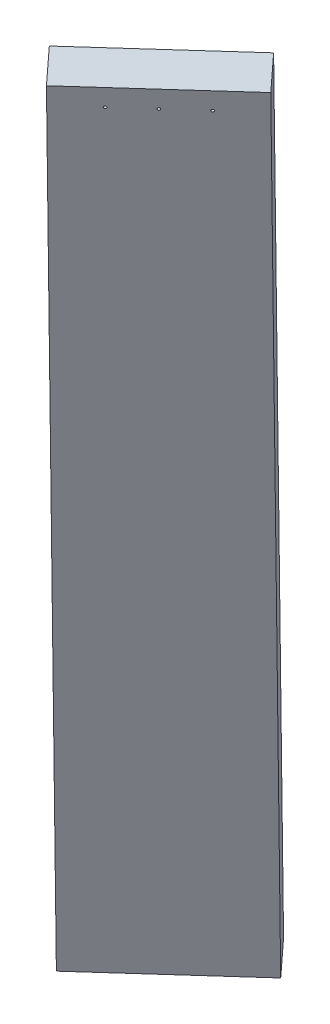
ISO-10303-21;
HEADER;
FILE_DESCRIPTION(('STEP AP214'),'2;1');
FILE_NAME('part.step','',(''),(''),'','','');
FILE_SCHEMA(('AUTOMOTIVE_DESIGN { 1 0 10303 214 1 1 1 1 }'));
ENDSEC;
DATA;
#1=APPLICATION_CONTEXT('core data for automotive mechanical design processes');
#2=APPLICATION_PROTOCOL_DEFINITION('international standard','automotive_design',2000,#1);
#3=PRODUCT_CONTEXT('',#1,'mechanical');
#4=PRODUCT('Part','Part','',(#3));
#5=PRODUCT_RELATED_PRODUCT_CATEGORY('part','',(#4));
#6=PRODUCT_DEFINITION_FORMATION('','',#4);
#7=PRODUCT_DEFINITION_CONTEXT('part definition',#1,'design');
#8=PRODUCT_DEFINITION('design','',#6,#7);
#9=PRODUCT_DEFINITION_SHAPE('','',#8);
#10=(LENGTH_UNIT() NAMED_UNIT(*) SI_UNIT(.MILLI.,.METRE.));
#11=(NAMED_UNIT(*) PLANE_ANGLE_UNIT() SI_UNIT($,.RADIAN.));
#12=(NAMED_UNIT(*) SI_UNIT($,.STERADIAN.) SOLID_ANGLE_UNIT());
#13=UNCERTAINTY_MEASURE_WITH_UNIT(LENGTH_MEASURE(1.E-05),#10,'distance_accuracy_value','');
#14=(GEOMETRIC_REPRESENTATION_CONTEXT(3) GLOBAL_UNCERTAINTY_ASSIGNED_CONTEXT((#13)) GLOBAL_UNIT_ASSIGNED_CONTEXT((#10,
#11,#12)) REPRESENTATION_CONTEXT('',''));
#15=CARTESIAN_POINT('',(0.,0.,0.));
#16=DIRECTION('',(0.,0.,1.));
#17=DIRECTION('',(1.,0.,0.));
#18=AXIS2_PLACEMENT_3D('',#15,#16,#17);
#19=CARTESIAN_POINT('',(-34.122427395229,436.359414766434,-238.340547783575));
#20=DIRECTION('',(0.659822359652896,-0.170734934507998,0.731767747198955));
#21=DIRECTION('',(0.742672409332212,0.,-0.669654905467501));
#22=AXIS2_PLACEMENT_3D('',#19,#20,#21);
#23=PLANE('',#22);
#24=CARTESIAN_POINT('',(-77.0709391759029,427.024147290678,-201.792705646519));
#25=DIRECTION('',(0.659822359652896,-0.170734934507998,0.731767747198955));
#26=DIRECTION('',(0.742672409332212,0.,-0.669654905467501));
#27=AXIS2_PLACEMENT_3D('',#24,#25,#26);
#28=CIRCLE('',#27,0.634999999999944);
#29=CARTESIAN_POINT('',(-76.599342195977,427.024147290678,-202.217936511491));
#30=VERTEX_POINT('',#29);
#31=EDGE_CURVE('E129',#30,#30,#28,.T.);
#32=ORIENTED_EDGE('',*,*,#31,.T.);
#33=EDGE_LOOP('',(#32));
#34=FACE_BOUND('',#33,.T.);
#35=CARTESIAN_POINT('',(-63.5096908061252,427.007987405434,-214.024419862397));
#36=DIRECTION('',(0.659822359652896,-0.170734934507998,0.731767747198955));
#37=DIRECTION('',(0.742672409332212,0.,-0.669654905467501));
#38=AXIS2_PLACEMENT_3D('',#35,#36,#37);
#39=CIRCLE('',#38,0.635000000000017);
#40=CARTESIAN_POINT('',(-63.0380938261993,427.007987405434,-214.449650727369));
#41=VERTEX_POINT('',#40);
#42=EDGE_CURVE('E119',#41,#41,#39,.T.);
#43=ORIENTED_EDGE('',*,*,#42,.T.);
#44=EDGE_LOOP('',(#43));
#45=FACE_BOUND('',#44,.T.);
#46=CARTESIAN_POINT('',(-49.9484424363475,426.991827520191,-226.256134078275));
#47=DIRECTION('',(0.659822359652896,-0.170734934507998,0.731767747198955));
#48=DIRECTION('',(0.742672409332212,0.,-0.669654905467501));
#49=AXIS2_PLACEMENT_3D('',#46,#47,#48);
#50=CIRCLE('',#49,0.634999999999992);
#51=CARTESIAN_POINT('',(-49.4768454564216,426.991827520191,-226.681364943247));
#52=VERTEX_POINT('',#51);
#53=EDGE_CURVE('E116',#52,#52,#50,.T.);
#54=ORIENTED_EDGE('',*,*,#53,.T.);
#55=EDGE_LOOP('',(#54));
#56=FACE_BOUND('',#55,.T.);
#57=DIRECTION('',(-0.742569432859524,0.000884862255525242,0.669768508069373));
#58=VECTOR('',#57,1.);
#59=CARTESIAN_POINT('',(-83.0493458819597,17.1564679610068,-292.031781118628));
#60=LINE('',#59,#58);
#61=CARTESIAN_POINT('',(-83.0493458819597,17.1564679610068,-292.031781118628));
#62=VERTEX_POINT('',#61);
#63=CARTESIAN_POINT('',(-139.63311515957,17.2238944392505,-240.995440201568));
#64=VERTEX_POINT('',#63);
#65=EDGE_CURVE('E105',#62,#64,#60,.T.);
#66=ORIENTED_EDGE('',*,*,#65,.T.);
#67=DIRECTION('',(-0.115000396020051,-0.985316598437953,-0.126198691585504));
#68=VECTOR('',#67,1.);
#69=CARTESIAN_POINT('',(-90.7061966728394,436.426841244678,-187.304206866515));
#70=LINE('',#69,#68);
#71=CARTESIAN_POINT('',(-90.7061966728394,436.426841244678,-187.304206866515));
#72=VERTEX_POINT('',#71);
#73=EDGE_CURVE('E11',#72,#64,#70,.T.);
#74=ORIENTED_EDGE('',*,*,#73,.F.);
#75=DIRECTION('',(-0.742569432859524,0.000884862255525242,0.669768508069373));
#76=VECTOR('',#75,1.);
#77=CARTESIAN_POINT('',(-34.122427395229,436.359414766434,-238.340547783575));
#78=LINE('',#77,#76);
#79=CARTESIAN_POINT('',(-34.122427395229,436.359414766434,-238.340547783575));
#80=VERTEX_POINT('',#79);
#81=EDGE_CURVE('E92',#80,#72,#78,.T.);
#82=ORIENTED_EDGE('',*,*,#81,.F.);
#83=DIRECTION('',(-0.115000396020051,-0.985316598437953,-0.126198691585504));
#84=VECTOR('',#83,1.);
#85=CARTESIAN_POINT('',(-34.122427395229,436.359414766434,-238.340547783575));
#86=LINE('',#85,#84);
#87=EDGE_CURVE('E101',#80,#62,#86,.T.);
#88=ORIENTED_EDGE('',*,*,#87,.T.);
#89=EDGE_LOOP('',(#66,#74,#82,#88));
#90=FACE_BOUND('',#89,.T.);
#91=ADVANCED_FACE('F39',(#34,#45,#56,#90),#23,.F.);
#92=CARTESIAN_POINT('',(-90.7061966728394,436.426841244678,-187.304206866515));
#93=DIRECTION('',(0.742569432859525,-0.000884862255525373,-0.669768508069372));
#94=DIRECTION('',(-0.669768770277605,0.,-0.742569723568653));
#95=AXIS2_PLACEMENT_3D('',#92,#93,#94);
#96=PLANE('',#95);
#97=DIRECTION('',(0.659822359652895,-0.170734934507998,0.731767747198956));
#98=VECTOR('',#97,1.);
#99=CARTESIAN_POINT('',(-139.63311515957,17.2238944392505,-240.995440201568));
#100=LINE('',#99,#98);
#101=CARTESIAN_POINT('',(-127.063499208182,13.9713939368731,-227.055264617428));
#102=VERTEX_POINT('',#101);
#103=EDGE_CURVE('E96',#64,#102,#100,.T.);
#104=ORIENTED_EDGE('',*,*,#103,.T.);
#105=DIRECTION('',(-0.115000396020051,-0.985316598437953,-0.126198691585504));
#106=VECTOR('',#105,1.);
#107=CARTESIAN_POINT('',(-78.1365807214517,433.1743407423,-173.364031282375));
#108=LINE('',#107,#106);
#109=CARTESIAN_POINT('',(-78.1365807214517,433.1743407423,-173.364031282375));
#110=VERTEX_POINT('',#109);
#111=EDGE_CURVE('E48',#110,#102,#108,.T.);
#112=ORIENTED_EDGE('',*,*,#111,.F.);
#113=DIRECTION('',(0.659822359652895,-0.170734934507998,0.731767747198956));
#114=VECTOR('',#113,1.);
#115=CARTESIAN_POINT('',(-90.7061966728394,436.426841244678,-187.304206866515));
#116=LINE('',#115,#114);
#117=EDGE_CURVE('E87',#72,#110,#116,.T.);
#118=ORIENTED_EDGE('',*,*,#117,.F.);
#119=ORIENTED_EDGE('',*,*,#73,.T.);
#120=EDGE_LOOP('',(#104,#112,#118,#119));
#121=FACE_BOUND('',#120,.T.);
#122=ADVANCED_FACE('F95',(#121),#96,.F.);
#123=CARTESIAN_POINT('',(-78.1365807214517,433.1743407423,-173.364031282375));
#124=DIRECTION('',(-0.659822359652896,0.170734934507998,-0.731767747198955));
#125=DIRECTION('',(-0.742672409332212,0.,0.669654905467501));
#126=AXIS2_PLACEMENT_3D('',#123,#124,#125);
#127=PLANE('',#126);
#128=CARTESIAN_POINT('',(-64.5013232245152,423.7716467883,-187.852530062379));
#129=DIRECTION('',(-0.659822359652896,0.170734934507998,-0.731767747198955));
#130=DIRECTION('',(-0.742672409332212,0.,0.669654905467501));
#131=AXIS2_PLACEMENT_3D('',#128,#129,#130);
#132=CIRCLE('',#131,0.634999999999944);
#133=CARTESIAN_POINT('',(-64.9729202044411,423.7716467883,-187.427299197407));
#134=VERTEX_POINT('',#133);
#135=EDGE_CURVE('E42',#134,#134,#132,.T.);
#136=ORIENTED_EDGE('',*,*,#135,.T.);
#137=EDGE_LOOP('',(#136));
#138=FACE_BOUND('',#137,.T.);
#139=CARTESIAN_POINT('',(-50.9400748547375,423.755486903057,-200.084244278257));
#140=DIRECTION('',(-0.659822359652896,0.170734934507998,-0.731767747198955));
#141=DIRECTION('',(-0.742672409332212,0.,0.669654905467501));
#142=AXIS2_PLACEMENT_3D('',#139,#140,#141);
#143=CIRCLE('',#142,0.635000000000017);
#144=CARTESIAN_POINT('',(-51.4116718346635,423.755486903057,-199.659013413285));
#145=VERTEX_POINT('',#144);
#146=EDGE_CURVE('E117',#145,#145,#143,.T.);
#147=ORIENTED_EDGE('',*,*,#146,.T.);
#148=EDGE_LOOP('',(#147));
#149=FACE_BOUND('',#148,.T.);
#150=CARTESIAN_POINT('',(-37.3788264849598,423.739327017814,-212.315958494135));
#151=DIRECTION('',(-0.659822359652896,0.170734934507998,-0.731767747198955));
#152=DIRECTION('',(-0.742672409332212,0.,0.669654905467501));
#153=AXIS2_PLACEMENT_3D('',#150,#151,#152);
#154=CIRCLE('',#153,0.634999999999992);
#155=CARTESIAN_POINT('',(-37.8504234648858,423.739327017814,-211.890727629163));
#156=VERTEX_POINT('',#155);
#157=EDGE_CURVE('E114',#156,#156,#154,.T.);
#158=ORIENTED_EDGE('',*,*,#157,.T.);
#159=EDGE_LOOP('',(#158));
#160=FACE_BOUND('',#159,.T.);
#161=DIRECTION('',(0.742569432859524,-0.000884862255525151,-0.669768508069373));
#162=VECTOR('',#161,1.);
#163=CARTESIAN_POINT('',(-127.063499208182,13.9713939368731,-227.055264617428));
#164=LINE('',#163,#162);
#165=CARTESIAN_POINT('',(-70.479729930572,13.9039674586295,-278.091605534488));
#166=VERTEX_POINT('',#165);
#167=EDGE_CURVE('E74',#102,#166,#164,.T.);
#168=ORIENTED_EDGE('',*,*,#167,.T.);
#169=DIRECTION('',(-0.115000396020051,-0.985316598437953,-0.126198691585504));
#170=VECTOR('',#169,1.);
#171=CARTESIAN_POINT('',(-21.5528114438413,433.106914264057,-224.400372199435));
#172=LINE('',#171,#170);
#173=CARTESIAN_POINT('',(-21.5528114438413,433.106914264057,-224.400372199435));
#174=VERTEX_POINT('',#173);
#175=EDGE_CURVE('E97',#174,#166,#172,.T.);
#176=ORIENTED_EDGE('',*,*,#175,.F.);
#177=DIRECTION('',(0.742569432859524,-0.000884862255525151,-0.669768508069373));
#178=VECTOR('',#177,1.);
#179=CARTESIAN_POINT('',(-78.1365807214517,433.1743407423,-173.364031282375));
#180=LINE('',#179,#178);
#181=EDGE_CURVE('E90',#110,#174,#180,.T.);
#182=ORIENTED_EDGE('',*,*,#181,.F.);
#183=ORIENTED_EDGE('',*,*,#111,.T.);
#184=EDGE_LOOP('',(#168,#176,#182,#183));
#185=FACE_BOUND('',#184,.T.);
#186=ADVANCED_FACE('F99',(#138,#149,#160,#185),#127,.F.);
#187=CARTESIAN_POINT('',(-21.5528114438413,433.106914264057,-224.400372199435));
#188=DIRECTION('',(-0.742569432859525,0.000884862255525275,0.669768508069372));
#189=DIRECTION('',(0.669768770277605,0.,0.742569723568652));
#190=AXIS2_PLACEMENT_3D('',#187,#188,#189);
#191=PLANE('',#190);
#192=DIRECTION('',(-0.659822359652896,0.170734934507998,-0.731767747198955));
#193=VECTOR('',#192,1.);
#194=CARTESIAN_POINT('',(-70.479729930572,13.9039674586295,-278.091605534488));
#195=LINE('',#194,#193);
#196=EDGE_CURVE('E80',#166,#62,#195,.T.);
#197=ORIENTED_EDGE('',*,*,#196,.T.);
#198=ORIENTED_EDGE('',*,*,#87,.F.);
#199=DIRECTION('',(-0.659822359652896,0.170734934507998,-0.731767747198955));
#200=VECTOR('',#199,1.);
#201=CARTESIAN_POINT('',(-21.5528114438413,433.106914264057,-224.400372199435));
#202=LINE('',#201,#200);
#203=EDGE_CURVE('E57',#174,#80,#202,.T.);
#204=ORIENTED_EDGE('',*,*,#203,.F.);
#205=ORIENTED_EDGE('',*,*,#175,.T.);
#206=EDGE_LOOP('',(#197,#198,#204,#205));
#207=FACE_BOUND('',#206,.T.);
#208=ADVANCED_FACE('F165',(#207),#191,.F.);
#209=CARTESIAN_POINT('',(45.5343856795281,390.135926157088,49.9683487516359));
#210=DIRECTION('',(0.115000396020051,0.985316598437953,0.126198691585504));
#211=DIRECTION('',(0.,-0.12704155567189,0.991897395466117));
#212=AXIS2_PLACEMENT_3D('',#209,#210,#211);
#213=PLANE('',#212);
#214=ORIENTED_EDGE('',*,*,#81,.T.);
#215=ORIENTED_EDGE('',*,*,#117,.T.);
#216=ORIENTED_EDGE('',*,*,#181,.T.);
#217=ORIENTED_EDGE('',*,*,#203,.T.);
#218=EDGE_LOOP('',(#214,#215,#216,#217));
#219=FACE_BOUND('',#218,.T.);
#220=ADVANCED_FACE('F88',(#219),#213,.T.);
#221=CARTESIAN_POINT('',(-3.39253280720258,-29.0670206483392,-3.72288458341669));
#222=DIRECTION('',(0.115000396020051,0.985316598437953,0.126198691585504));
#223=DIRECTION('',(0.,-0.12704155567189,0.991897395466117));
#224=AXIS2_PLACEMENT_3D('',#221,#222,#223);
#225=PLANE('',#224);
#226=CARTESIAN_POINT('',(-91.4289786693234,15.5302177098181,-271.698508067053));
#227=DIRECTION('',(-0.115000396020051,-0.985316598437953,-0.126198691585503));
#228=DIRECTION('',(0.,0.12704155567189,-0.991897395466117));
#229=AXIS2_PLACEMENT_3D('',#226,#227,#228);
#230=CIRCLE('',#229,0.634999999999979);
#231=CARTESIAN_POINT('',(-91.4289786693234,15.6108890976697,-272.328362913174));
#232=VERTEX_POINT('',#231);
#233=EDGE_CURVE('E135',#232,#232,#230,.T.);
#234=ORIENTED_EDGE('',*,*,#233,.F.);
#235=EDGE_LOOP('',(#234));
#236=FACE_BOUND('',#235,.T.);
#237=CARTESIAN_POINT('',(-104.927594402749,15.5302177098181,-259.397697848156));
#238=DIRECTION('',(-0.115000396020051,-0.985316598437953,-0.126198691585503));
#239=DIRECTION('',(0.,0.12704155567189,-0.991897395466117));
#240=AXIS2_PLACEMENT_3D('',#237,#238,#239);
#241=CIRCLE('',#240,0.634999999999992);
#242=CARTESIAN_POINT('',(-104.927594402749,15.6108890976697,-260.027552694277));
#243=VERTEX_POINT('',#242);
#244=EDGE_CURVE('E138',#243,#243,#241,.T.);
#245=ORIENTED_EDGE('',*,*,#244,.F.);
#246=EDGE_LOOP('',(#245));
#247=FACE_BOUND('',#246,.T.);
#248=CARTESIAN_POINT('',(-118.426210136174,15.5302177098181,-247.096887629259));
#249=DIRECTION('',(-0.115000396020051,-0.985316598437953,-0.126198691585503));
#250=DIRECTION('',(0.,0.12704155567189,-0.991897395466117));
#251=AXIS2_PLACEMENT_3D('',#248,#249,#250);
#252=CIRCLE('',#251,0.634999999999998);
#253=CARTESIAN_POINT('',(-118.426210136174,15.6108890976697,-247.72674247538));
#254=VERTEX_POINT('',#253);
#255=EDGE_CURVE('E144',#254,#254,#252,.T.);
#256=ORIENTED_EDGE('',*,*,#255,.F.);
#257=EDGE_LOOP('',(#256));
#258=FACE_BOUND('',#257,.T.);
#259=ORIENTED_EDGE('',*,*,#65,.F.);
#260=ORIENTED_EDGE('',*,*,#196,.F.);
#261=ORIENTED_EDGE('',*,*,#167,.F.);
#262=ORIENTED_EDGE('',*,*,#103,.F.);
#263=EDGE_LOOP('',(#259,#260,#261,#262));
#264=FACE_BOUND('',#263,.T.);
#265=ADVANCED_FACE('F155',(#236,#247,#258,#264),#225,.F.);
#266=CARTESIAN_POINT('',(-112.584190018355,65.5843009104661,-240.685994096716));
#267=DIRECTION('',(-0.115000396020051,-0.985316598437953,-0.126198691585503));
#268=DIRECTION('',(0.,0.12704155567189,-0.991897395466117));
#269=AXIS2_PLACEMENT_3D('',#266,#267,#268);
#270=CYLINDRICAL_SURFACE('',#269,0.634999999999998);
#271=CARTESIAN_POINT('',(-112.584190018355,65.5843009104661,-240.685994096716));
#272=DIRECTION('',(-0.115000396020051,-0.985316598437953,-0.126198691585503));
#273=DIRECTION('',(0.,0.12704155567189,-0.991897395466117));
#274=AXIS2_PLACEMENT_3D('',#271,#272,#273);
#275=CIRCLE('',#274,0.634999999999998);
#276=CARTESIAN_POINT('',(-112.584190018355,65.6649722983177,-241.315848942837));
#277=VERTEX_POINT('',#276);
#278=EDGE_CURVE('E132',#277,#277,#275,.T.);
#279=ORIENTED_EDGE('',*,*,#278,.F.);
#280=EDGE_LOOP('',(#279));
#281=FACE_BOUND('',#280,.T.);
#282=ORIENTED_EDGE('',*,*,#255,.T.);
#283=EDGE_LOOP('',(#282));
#284=FACE_BOUND('',#283,.T.);
#285=ADVANCED_FACE('F152',(#281,#284),#270,.F.);
#286=CARTESIAN_POINT('',(-112.584190018355,65.5843009104661,-240.685994096716));
#287=DIRECTION('',(-0.115000396020051,-0.985316598437953,-0.126198691585503));
#288=DIRECTION('',(0.,0.12704155567189,-0.991897395466117));
#289=AXIS2_PLACEMENT_3D('',#286,#287,#288);
#290=PLANE('',#289);
#291=ORIENTED_EDGE('',*,*,#278,.T.);
#292=EDGE_LOOP('',(#291));
#293=FACE_BOUND('',#292,.T.);
#294=ADVANCED_FACE('F150',(#293),#290,.T.);
#295=CARTESIAN_POINT('',(-99.0855742849301,65.5843009104661,-252.986804315613));
#296=DIRECTION('',(-0.115000396020051,-0.985316598437953,-0.126198691585503));
#297=DIRECTION('',(0.,0.12704155567189,-0.991897395466117));
#298=AXIS2_PLACEMENT_3D('',#295,#296,#297);
#299=CYLINDRICAL_SURFACE('',#298,0.634999999999992);
#300=CARTESIAN_POINT('',(-99.0855742849301,65.5843009104661,-252.986804315613));
#301=DIRECTION('',(-0.115000396020051,-0.985316598437953,-0.126198691585503));
#302=DIRECTION('',(0.,0.12704155567189,-0.991897395466117));
#303=AXIS2_PLACEMENT_3D('',#300,#301,#302);
#304=CIRCLE('',#303,0.634999999999992);
#305=CARTESIAN_POINT('',(-99.0855742849301,65.6649722983177,-253.616659161734));
#306=VERTEX_POINT('',#305);
#307=EDGE_CURVE('E141',#306,#306,#304,.T.);
#308=ORIENTED_EDGE('',*,*,#307,.F.);
#309=EDGE_LOOP('',(#308));
#310=FACE_BOUND('',#309,.T.);
#311=ORIENTED_EDGE('',*,*,#244,.T.);
#312=EDGE_LOOP('',(#311));
#313=FACE_BOUND('',#312,.T.);
#314=ADVANCED_FACE('F211',(#310,#313),#299,.F.);
#315=CARTESIAN_POINT('',(-99.0855742849301,65.5843009104661,-252.986804315613));
#316=DIRECTION('',(-0.115000396020051,-0.985316598437953,-0.126198691585503));
#317=DIRECTION('',(0.,0.12704155567189,-0.991897395466117));
#318=AXIS2_PLACEMENT_3D('',#315,#316,#317);
#319=PLANE('',#318);
#320=ORIENTED_EDGE('',*,*,#307,.T.);
#321=EDGE_LOOP('',(#320));
#322=FACE_BOUND('',#321,.T.);
#323=ADVANCED_FACE('F209',(#322),#319,.T.);
#324=CARTESIAN_POINT('',(-85.5869585515048,65.5843009104661,-265.28761453451));
#325=DIRECTION('',(-0.115000396020051,-0.985316598437953,-0.126198691585503));
#326=DIRECTION('',(0.,0.12704155567189,-0.991897395466117));
#327=AXIS2_PLACEMENT_3D('',#324,#325,#326);
#328=CYLINDRICAL_SURFACE('',#327,0.634999999999979);
#329=CARTESIAN_POINT('',(-85.5869585515048,65.5843009104661,-265.28761453451));
#330=DIRECTION('',(-0.115000396020051,-0.985316598437953,-0.126198691585503));
#331=DIRECTION('',(0.,0.12704155567189,-0.991897395466117));
#332=AXIS2_PLACEMENT_3D('',#329,#330,#331);
#333=CIRCLE('',#332,0.634999999999979);
#334=CARTESIAN_POINT('',(-85.5869585515048,65.6649722983177,-265.917469380631));
#335=VERTEX_POINT('',#334);
#336=EDGE_CURVE('E108',#335,#335,#333,.T.);
#337=ORIENTED_EDGE('',*,*,#336,.F.);
#338=EDGE_LOOP('',(#337));
#339=FACE_BOUND('',#338,.T.);
#340=ORIENTED_EDGE('',*,*,#233,.T.);
#341=EDGE_LOOP('',(#340));
#342=FACE_BOUND('',#341,.T.);
#343=ADVANCED_FACE('F205',(#339,#342),#328,.F.);
#344=CARTESIAN_POINT('',(-85.5869585515048,65.5843009104661,-265.28761453451));
#345=DIRECTION('',(-0.115000396020051,-0.985316598437953,-0.126198691585503));
#346=DIRECTION('',(0.,0.12704155567189,-0.991897395466117));
#347=AXIS2_PLACEMENT_3D('',#344,#345,#346);
#348=PLANE('',#347);
#349=ORIENTED_EDGE('',*,*,#336,.T.);
#350=EDGE_LOOP('',(#349));
#351=FACE_BOUND('',#350,.T.);
#352=ADVANCED_FACE('F199',(#351),#348,.T.);
#353=CARTESIAN_POINT('',(-121.877913588961,445.604221245219,-306.028615705375));
#354=DIRECTION('',(0.659822359652897,-0.170734934507998,0.731767747198955));
#355=DIRECTION('',(0.742672409332212,0.,-0.669654905467501));
#356=AXIS2_PLACEMENT_3D('',#353,#354,#355);
#357=CYLINDRICAL_SURFACE('',#356,0.634999999999992);
#358=ORIENTED_EDGE('',*,*,#157,.F.);
#359=EDGE_LOOP('',(#358));
#360=FACE_BOUND('',#359,.T.);
#361=ORIENTED_EDGE('',*,*,#53,.F.);
#362=EDGE_LOOP('',(#361));
#363=FACE_BOUND('',#362,.T.);
#364=ADVANCED_FACE('F189',(#360,#363),#357,.F.);
#365=CARTESIAN_POINT('',(-135.439161958739,445.620381130462,-293.796901489497));
#366=DIRECTION('',(0.659822359652897,-0.170734934507998,0.731767747198955));
#367=DIRECTION('',(0.742672409332212,0.,-0.669654905467501));
#368=AXIS2_PLACEMENT_3D('',#365,#366,#367);
#369=CYLINDRICAL_SURFACE('',#368,0.635000000000017);
#370=ORIENTED_EDGE('',*,*,#146,.F.);
#371=EDGE_LOOP('',(#370));
#372=FACE_BOUND('',#371,.T.);
#373=ORIENTED_EDGE('',*,*,#42,.F.);
#374=EDGE_LOOP('',(#373));
#375=FACE_BOUND('',#374,.T.);
#376=ADVANCED_FACE('F186',(#372,#375),#369,.F.);
#377=CARTESIAN_POINT('',(-149.000410328517,445.636541015705,-281.565187273619));
#378=DIRECTION('',(0.659822359652897,-0.170734934507998,0.731767747198955));
#379=DIRECTION('',(0.742672409332212,0.,-0.669654905467501));
#380=AXIS2_PLACEMENT_3D('',#377,#378,#379);
#381=CYLINDRICAL_SURFACE('',#380,0.634999999999944);
#382=ORIENTED_EDGE('',*,*,#135,.F.);
#383=EDGE_LOOP('',(#382));
#384=FACE_BOUND('',#383,.T.);
#385=ORIENTED_EDGE('',*,*,#31,.F.);
#386=EDGE_LOOP('',(#385));
#387=FACE_BOUND('',#386,.T.);
#388=ADVANCED_FACE('F188',(#384,#387),#381,.F.);
#389=CLOSED_SHELL('',(#91,#122,#186,#208,#220,#265,#285,#294,#314,#323,#343,#352,#364,#376,#388));
#390=MANIFOLD_SOLID_BREP('B2',#389);
#391=ADVANCED_BREP_SHAPE_REPRESENTATION('',(#18,#390),#14);
#392=SHAPE_DEFINITION_REPRESENTATION(#9,#391);
ENDSEC;
END-ISO-10303-21;
